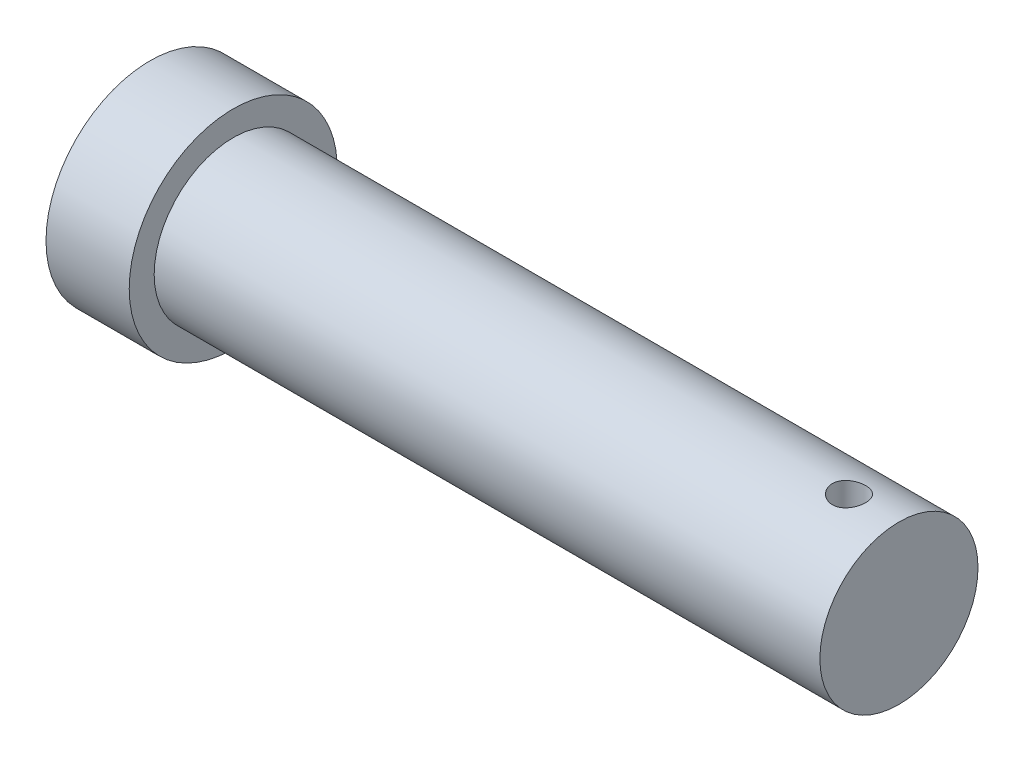
ISO-10303-21;
HEADER;
FILE_DESCRIPTION(('STEP AP214'),'2;1');
FILE_NAME('part.step','',(''),(''),'','','');
FILE_SCHEMA(('AUTOMOTIVE_DESIGN { 1 0 10303 214 1 1 1 1 }'));
ENDSEC;
DATA;
#1=APPLICATION_CONTEXT('core data for automotive mechanical design processes');
#2=APPLICATION_PROTOCOL_DEFINITION('international standard','automotive_design',2000,#1);
#3=PRODUCT_CONTEXT('',#1,'mechanical');
#4=PRODUCT('Part','Part','',(#3));
#5=PRODUCT_RELATED_PRODUCT_CATEGORY('part','',(#4));
#6=PRODUCT_DEFINITION_FORMATION('','',#4);
#7=PRODUCT_DEFINITION_CONTEXT('part definition',#1,'design');
#8=PRODUCT_DEFINITION('design','',#6,#7);
#9=PRODUCT_DEFINITION_SHAPE('','',#8);
#10=(LENGTH_UNIT() NAMED_UNIT(*) SI_UNIT(.MILLI.,.METRE.));
#11=(NAMED_UNIT(*) PLANE_ANGLE_UNIT() SI_UNIT($,.RADIAN.));
#12=(NAMED_UNIT(*) SI_UNIT($,.STERADIAN.) SOLID_ANGLE_UNIT());
#13=UNCERTAINTY_MEASURE_WITH_UNIT(LENGTH_MEASURE(1.E-05),#10,'distance_accuracy_value','');
#14=(GEOMETRIC_REPRESENTATION_CONTEXT(3) GLOBAL_UNCERTAINTY_ASSIGNED_CONTEXT((#13)) GLOBAL_UNIT_ASSIGNED_CONTEXT((#10,
#11,#12)) REPRESENTATION_CONTEXT('',''));
#15=CARTESIAN_POINT('',(0.,0.,0.));
#16=DIRECTION('',(0.,0.,1.));
#17=DIRECTION('',(1.,0.,0.));
#18=AXIS2_PLACEMENT_3D('',#15,#16,#17);
#19=CARTESIAN_POINT('',(27.,0.,0.));
#20=DIRECTION('',(-1.,0.,0.));
#21=DIRECTION('',(0.,0.,1.));
#22=AXIS2_PLACEMENT_3D('',#19,#20,#21);
#23=CYLINDRICAL_SURFACE('',#22,2.85);
#24=CARTESIAN_POINT('',(25.2,2.78612634315101,-0.600000000000002));
#25=CARTESIAN_POINT('',(25.1667009135158,2.78612701399481,-0.599998814546899));
#26=CARTESIAN_POINT('',(25.1333872784626,2.7867298142187,-0.597218504712191));
#27=CARTESIAN_POINT('',(25.0677051616874,2.78907185232426,-0.586181590233304));
#28=CARTESIAN_POINT('',(25.0353374153246,2.79081195104259,-0.57792083729598));
#29=CARTESIAN_POINT('',(24.9725067509061,2.79522297529664,-0.556192827014321));
#30=CARTESIAN_POINT('',(24.9420418696356,2.79789292214083,-0.542731042280543));
#31=CARTESIAN_POINT('',(24.883802993568,2.80386163526096,-0.510998467066112));
#32=CARTESIAN_POINT('',(24.8560289011656,2.80716037871515,-0.492727851109587));
#33=CARTESIAN_POINT('',(24.8035242593864,2.81407270303313,-0.451591317533301));
#34=CARTESIAN_POINT('',(24.7788419748818,2.81769005736826,-0.428664420797291));
#35=CARTESIAN_POINT('',(24.7336436914392,2.82479890520401,-0.378997827627041));
#36=CARTESIAN_POINT('',(24.7131280017945,2.82829038934527,-0.352257848391798));
#37=CARTESIAN_POINT('',(24.6766559731375,2.83479502116815,-0.295402312917658));
#38=CARTESIAN_POINT('',(24.6607458085032,2.83780319845043,-0.265256518969008));
#39=CARTESIAN_POINT('',(24.634234844121,2.8429597572222,-0.202645438700851));
#40=CARTESIAN_POINT('',(24.6236334930786,2.84510822798339,-0.170180393624558));
#41=CARTESIAN_POINT('',(24.6081921978229,2.84827663660446,-0.104353810802695));
#42=CARTESIAN_POINT('',(24.6032706472889,2.84931254411822,-0.071012197447821));
#43=CARTESIAN_POINT('',(24.5990737512601,2.85019435909322,-0.00396153371564469));
#44=CARTESIAN_POINT('',(24.5997978054718,2.85004039307295,0.0297474772159071));
#45=CARTESIAN_POINT('',(24.606810286065,2.84857208969557,0.0960143037161188));
#46=CARTESIAN_POINT('',(24.613010777816,2.84727609060527,0.12858189051348));
#47=CARTESIAN_POINT('',(24.6306602894266,2.84369013675044,0.192203706548366));
#48=CARTESIAN_POINT('',(24.6421095347795,2.84140013928265,0.223257870703821));
#49=CARTESIAN_POINT('',(24.6700109762059,2.83605367252079,0.283218456751872));
#50=CARTESIAN_POINT('',(24.6864970043082,2.83299204532355,0.312108656865224));
#51=CARTESIAN_POINT('',(24.7239788944963,2.82643884013843,0.366744827495318));
#52=CARTESIAN_POINT('',(24.7449753284568,2.82294720765413,0.392490398654488));
#53=CARTESIAN_POINT('',(24.7913624179472,2.81583921697497,0.440628989093079));
#54=CARTESIAN_POINT('',(24.81683003759,2.81222175210661,0.462947742532497));
#55=CARTESIAN_POINT('',(24.8711836977434,2.80533327136152,0.503010620403578));
#56=CARTESIAN_POINT('',(24.9000698176529,2.80206226353503,0.52075463855097));
#57=CARTESIAN_POINT('',(24.9605545419967,2.7962344490956,0.55119401930204));
#58=CARTESIAN_POINT('',(24.9921599451801,2.79367950484636,0.563876252666613));
#59=CARTESIAN_POINT('',(25.0571195880866,2.78959953602516,0.583727840358225));
#60=CARTESIAN_POINT('',(25.0904735720488,2.78807436128166,0.590897998533679));
#61=CARTESIAN_POINT('',(25.1573074435771,2.78625700739595,0.599408596934946));
#62=CARTESIAN_POINT('',(25.1907730081155,2.78594204481568,0.600856774057887));
#63=CARTESIAN_POINT('',(25.2574674290928,2.78651945291243,0.598173192304226));
#64=CARTESIAN_POINT('',(25.2906963003754,2.78741174719711,0.594041786490441));
#65=CARTESIAN_POINT('',(25.3556048066558,2.79028169499288,0.580409527509041));
#66=CARTESIAN_POINT('',(25.3872973082081,2.7922475084337,0.570967216003285));
#67=CARTESIAN_POINT('',(25.4486504579894,2.79703245020334,0.547044208443247));
#68=CARTESIAN_POINT('',(25.4783109234017,2.79985165518622,0.532563059768795));
#69=CARTESIAN_POINT('',(25.535226614715,2.80607628905434,0.498733169468147));
#70=CARTESIAN_POINT('',(25.562441240349,2.80948954619567,0.479317590882256));
#71=CARTESIAN_POINT('',(25.613265558928,2.81649668188266,0.436258163280139));
#72=CARTESIAN_POINT('',(25.6368748381276,2.8200905810958,0.412613829651866));
#73=CARTESIAN_POINT('',(25.6802321079327,2.82712864439007,0.361282267099748));
#74=CARTESIAN_POINT('',(25.6999069165104,2.83056918247882,0.333532645153904));
#75=CARTESIAN_POINT('',(25.7343153298923,2.83684783547197,0.275059455569286));
#76=CARTESIAN_POINT('',(25.7490491557515,2.83968597732494,0.244336021055369));
#77=CARTESIAN_POINT('',(25.7730533068833,2.84442467789728,0.180971054854553));
#78=CARTESIAN_POINT('',(25.7823567097955,2.84633090128262,0.148342496448086));
#79=CARTESIAN_POINT('',(25.7953399391982,2.84901539172905,0.0819412481818664));
#80=CARTESIAN_POINT('',(25.7990205200098,2.8497938100884,0.0481687124121357));
#81=CARTESIAN_POINT('',(25.8006218107384,2.85013090115407,-0.0188651925927722));
#82=CARTESIAN_POINT('',(25.7986521195598,2.84971278357047,-0.0521238749636385));
#83=CARTESIAN_POINT('',(25.7892525128007,2.84775309308191,-0.117824895016765));
#84=CARTESIAN_POINT('',(25.7818226816768,2.84621153755414,-0.150267245317907));
#85=CARTESIAN_POINT('',(25.761764552677,2.84217942631055,-0.213337271614287));
#86=CARTESIAN_POINT('',(25.7491507408893,2.83969151651298,-0.243969734480415));
#87=CARTESIAN_POINT('',(25.7190972625363,2.83403334439395,-0.302698540824581));
#88=CARTESIAN_POINT('',(25.7016571655691,2.83086302122135,-0.330794657818092));
#89=CARTESIAN_POINT('',(25.6620832652322,2.82411669006248,-0.384191161912313));
#90=CARTESIAN_POINT('',(25.6398717799327,2.82053448985304,-0.409433199925055));
#91=CARTESIAN_POINT('',(25.5915436325484,2.81340299548733,-0.45586929743981));
#92=CARTESIAN_POINT('',(25.5654260386776,2.80985370939772,-0.477062388327741));
#93=CARTESIAN_POINT('',(25.5096447381852,2.8031419671117,-0.515046283249627));
#94=CARTESIAN_POINT('',(25.4799417055773,2.79998475050277,-0.53178030827098));
#95=CARTESIAN_POINT('',(25.4180859036835,2.7944796118598,-0.559992792367471));
#96=CARTESIAN_POINT('',(25.3859353037988,2.79213098310132,-0.571475843811149));
#97=CARTESIAN_POINT('',(25.3281111899501,2.78895879032804,-0.586730647304422));
#98=CARTESIAN_POINT('',(25.3027588684033,2.78790346017021,-0.591697402827667));
#99=CARTESIAN_POINT('',(25.2516072650666,2.78648699116868,-0.59833246942034));
#100=CARTESIAN_POINT('',(25.2258080020601,2.78612582322268,-0.600000918769235));
#101=CARTESIAN_POINT('',(25.2,2.78612634315101,-0.600000000000002));
#102=B_SPLINE_CURVE_WITH_KNOTS('',3,(#24,#25,#26,#27,#28,#29,#30,#31,#32,#33,#34,#35,#36,#37,
#38,#39,#40,#41,#42,#43,#44,#45,#46,#47,#48,#49,#50,#51,#52,#53,#54,#55,#56,#57,#58,#59,#60,#61,
#62,#63,#64,#65,#66,#67,#68,#69,#70,#71,#72,#73,#74,#75,#76,#77,#78,#79,#80,#81,#82,#83,#84,#85,
#86,#87,#88,#89,#90,#91,#92,#93,#94,#95,#96,#97,#98,#99,#100,#101),.UNSPECIFIED.,.T.,.F.,(4,2,2,
2,2,2,2,2,2,2,2,2,2,2,2,2,2,2,2,2,2,2,2,2,2,2,2,2,2,2,2,2,2,2,2,2,2,2,4),(0.,0.0998027160016778,
0.199681061654563,0.299454598647128,0.399224515115622,0.50039673159231,0.601576455512071,
0.703737997387747,0.805888928082372,0.906553147157054,1.00720666281771,1.10627279301604,
1.20534317962625,1.30509422326277,1.40485792181237,1.50654640831832,1.60823725712771,
1.71019018337471,1.81212823858849,1.91213752842906,2.01214049021469,2.11106214233086,
2.20999268250927,2.31034218697567,2.41070319879473,2.51278576524374,2.61486376400487,
2.71631331865759,2.81774926230401,2.91723102438429,3.01671124772717,3.11591535404781,
3.2151283101142,3.31609896959206,3.41709375373019,3.51931896465334,3.62145460019752,
3.6988085748546,3.77615930642484),.UNSPECIFIED.);
#103=CARTESIAN_POINT('',(25.2,2.78612634315101,-0.600000000000002));
#104=VERTEX_POINT('',#103);
#105=EDGE_CURVE('E50',#104,#104,#102,.T.);
#106=ORIENTED_EDGE('',*,*,#105,.F.);
#107=EDGE_LOOP('',(#106));
#108=FACE_BOUND('',#107,.T.);
#109=CARTESIAN_POINT('',(25.2,-2.78612634315101,-0.600000000000002));
#110=CARTESIAN_POINT('',(25.2332990864842,-2.78612701399481,-0.599998814546899));
#111=CARTESIAN_POINT('',(25.2666127215374,-2.7867298142187,-0.597218504712192));
#112=CARTESIAN_POINT('',(25.3322948383126,-2.78907185232426,-0.586181590233305));
#113=CARTESIAN_POINT('',(25.3646625846754,-2.79081195104259,-0.577920837295979));
#114=CARTESIAN_POINT('',(25.4274932490939,-2.79522297529664,-0.556192827014321));
#115=CARTESIAN_POINT('',(25.4579581303644,-2.79789292214083,-0.542731042280546));
#116=CARTESIAN_POINT('',(25.516197006432,-2.80386163526096,-0.510998467066115));
#117=CARTESIAN_POINT('',(25.5439710988344,-2.80716037871515,-0.492727851109587));
#118=CARTESIAN_POINT('',(25.5964757406136,-2.81407270303313,-0.451591317533301));
#119=CARTESIAN_POINT('',(25.6211580251182,-2.81769005736826,-0.428664420797292));
#120=CARTESIAN_POINT('',(25.6663563085608,-2.82479890520401,-0.378997827627043));
#121=CARTESIAN_POINT('',(25.6868719982054,-2.82829038934527,-0.352257848391798));
#122=CARTESIAN_POINT('',(25.7233440268625,-2.83479502116815,-0.295402312917658));
#123=CARTESIAN_POINT('',(25.7392541914968,-2.83780319845043,-0.265256518969008));
#124=CARTESIAN_POINT('',(25.765765155879,-2.8429597572222,-0.202645438700851));
#125=CARTESIAN_POINT('',(25.7763665069214,-2.84510822798339,-0.170180393624558));
#126=CARTESIAN_POINT('',(25.7918078021771,-2.84827663660446,-0.104353810802694));
#127=CARTESIAN_POINT('',(25.7967293527111,-2.84931254411822,-0.071012197447821));
#128=CARTESIAN_POINT('',(25.8009262487399,-2.85019435909322,-0.00396153371564484));
#129=CARTESIAN_POINT('',(25.8002021945282,-2.85004039307295,0.029747477215907));
#130=CARTESIAN_POINT('',(25.793189713935,-2.84857208969557,0.0960143037161187));
#131=CARTESIAN_POINT('',(25.786989222184,-2.84727609060527,0.12858189051348));
#132=CARTESIAN_POINT('',(25.7693397105734,-2.84369013675044,0.192203706548366));
#133=CARTESIAN_POINT('',(25.7578904652205,-2.84140013928265,0.223257870703821));
#134=CARTESIAN_POINT('',(25.7299890237941,-2.83605367252079,0.283218456751872));
#135=CARTESIAN_POINT('',(25.7135029956918,-2.83299204532355,0.312108656865224));
#136=CARTESIAN_POINT('',(25.6760211055037,-2.82643884013843,0.366744827495318));
#137=CARTESIAN_POINT('',(25.6550246715432,-2.82294720765413,0.392490398654488));
#138=CARTESIAN_POINT('',(25.6086375820528,-2.81583921697497,0.440628989093079));
#139=CARTESIAN_POINT('',(25.58316996241,-2.81222175210661,0.462947742532498));
#140=CARTESIAN_POINT('',(25.5288163022566,-2.80533327136152,0.503010620403579));
#141=CARTESIAN_POINT('',(25.4999301823471,-2.80206226353503,0.520754638550969));
#142=CARTESIAN_POINT('',(25.4394454580033,-2.7962344490956,0.55119401930204));
#143=CARTESIAN_POINT('',(25.4078400548199,-2.79367950484636,0.563876252666613));
#144=CARTESIAN_POINT('',(25.3428804119134,-2.78959953602516,0.583727840358225));
#145=CARTESIAN_POINT('',(25.3095264279512,-2.78807436128166,0.59089799853368));
#146=CARTESIAN_POINT('',(25.2426925564229,-2.78625700739595,0.599408596934946));
#147=CARTESIAN_POINT('',(25.2092269918845,-2.78594204481568,0.600856774057887));
#148=CARTESIAN_POINT('',(25.1425325709072,-2.78651945291243,0.598173192304226));
#149=CARTESIAN_POINT('',(25.1093036996246,-2.78741174719711,0.594041786490442));
#150=CARTESIAN_POINT('',(25.0443951933442,-2.79028169499288,0.580409527509041));
#151=CARTESIAN_POINT('',(25.0127026917919,-2.7922475084337,0.570967216003284));
#152=CARTESIAN_POINT('',(24.9513495420106,-2.79703245020334,0.547044208443245));
#153=CARTESIAN_POINT('',(24.9216890765983,-2.79985165518622,0.532563059768795));
#154=CARTESIAN_POINT('',(24.864773385285,-2.80607628905434,0.498733169468147));
#155=CARTESIAN_POINT('',(24.837558759651,-2.80948954619567,0.479317590882256));
#156=CARTESIAN_POINT('',(24.786734441072,-2.81649668188266,0.436258163280138));
#157=CARTESIAN_POINT('',(24.7631251618724,-2.8200905810958,0.412613829651866));
#158=CARTESIAN_POINT('',(24.7197678920673,-2.82712864439007,0.361282267099748));
#159=CARTESIAN_POINT('',(24.7000930834896,-2.83056918247882,0.333532645153904));
#160=CARTESIAN_POINT('',(24.6656846701077,-2.83684783547197,0.275059455569286));
#161=CARTESIAN_POINT('',(24.6509508442485,-2.83968597732494,0.24433602105537));
#162=CARTESIAN_POINT('',(24.6269466931167,-2.84442467789728,0.180971054854553));
#163=CARTESIAN_POINT('',(24.6176432902045,-2.84633090128262,0.148342496448086));
#164=CARTESIAN_POINT('',(24.6046600608018,-2.84901539172905,0.081941248181865));
#165=CARTESIAN_POINT('',(24.6009794799902,-2.8497938100884,0.0481687124121351));
#166=CARTESIAN_POINT('',(24.5993781892616,-2.85013090115407,-0.018865192592772));
#167=CARTESIAN_POINT('',(24.6013478804402,-2.84971278357047,-0.0521238749636384));
#168=CARTESIAN_POINT('',(24.6107474871993,-2.84775309308191,-0.117824895016766));
#169=CARTESIAN_POINT('',(24.6181773183232,-2.84621153755414,-0.150267245317908));
#170=CARTESIAN_POINT('',(24.638235447323,-2.84217942631055,-0.213337271614286));
#171=CARTESIAN_POINT('',(24.6508492591107,-2.83969151651298,-0.243969734480414));
#172=CARTESIAN_POINT('',(24.6809027374637,-2.83403334439395,-0.302698540824579));
#173=CARTESIAN_POINT('',(24.6983428344309,-2.83086302122135,-0.330794657818091));
#174=CARTESIAN_POINT('',(24.7379167347678,-2.82411669006248,-0.384191161912314));
#175=CARTESIAN_POINT('',(24.7601282200673,-2.82053448985304,-0.409433199925058));
#176=CARTESIAN_POINT('',(24.8084563674516,-2.81340299548733,-0.455869297439812));
#177=CARTESIAN_POINT('',(24.8345739613223,-2.80985370939772,-0.477062388327742));
#178=CARTESIAN_POINT('',(24.8903552618148,-2.8031419671117,-0.515046283249627));
#179=CARTESIAN_POINT('',(24.9200582944227,-2.79998475050277,-0.531780308270979));
#180=CARTESIAN_POINT('',(24.9819140963165,-2.7944796118598,-0.55999279236747));
#181=CARTESIAN_POINT('',(25.0140646962012,-2.79213098310132,-0.571475843811149));
#182=CARTESIAN_POINT('',(25.0718888100499,-2.78895879032804,-0.586730647304422));
#183=CARTESIAN_POINT('',(25.0972411315967,-2.78790346017021,-0.591697402827667));
#184=CARTESIAN_POINT('',(25.1483927349334,-2.78648699116868,-0.598332469420339));
#185=CARTESIAN_POINT('',(25.1741919979399,-2.78612582322268,-0.600000918769234));
#186=CARTESIAN_POINT('',(25.2,-2.78612634315101,-0.600000000000002));
#187=B_SPLINE_CURVE_WITH_KNOTS('',3,(#109,#110,#111,#112,#113,#114,#115,#116,#117,#118,#119,
#120,#121,#122,#123,#124,#125,#126,#127,#128,#129,#130,#131,#132,#133,#134,#135,#136,#137,#138,
#139,#140,#141,#142,#143,#144,#145,#146,#147,#148,#149,#150,#151,#152,#153,#154,#155,#156,#157,
#158,#159,#160,#161,#162,#163,#164,#165,#166,#167,#168,#169,#170,#171,#172,#173,#174,#175,#176,
#177,#178,#179,#180,#181,#182,#183,#184,#185,#186),.UNSPECIFIED.,.T.,.F.,(4,2,2,2,2,2,2,2,2,2,2,
2,2,2,2,2,2,2,2,2,2,2,2,2,2,2,2,2,2,2,2,2,2,2,2,2,2,2,4),(0.,0.0998027160016742,
0.199681061654556,0.299454598647123,0.399224515115619,0.500396731592306,0.60157645551207,
0.703737997387746,0.805888928082371,0.906553147157052,1.0072066628177,1.10627279301604,
1.20534317962625,1.30509422326277,1.40485792181237,1.50654640831832,1.60823725712771,
1.71019018337471,1.81212823858849,1.91213752842906,2.0121404902147,2.11106214233086,
2.20999268250927,2.31034218697567,2.41070319879473,2.51278576524374,2.61486376400487,
2.71631331865759,2.81774926230401,2.91723102438429,3.01671124772717,3.1159153540478,
3.2151283101142,3.31609896959207,3.41709375373019,3.51931896465334,3.62145460019752,
3.6988085748546,3.77615930642484),.UNSPECIFIED.);
#188=CARTESIAN_POINT('',(25.2,-2.78612634315101,-0.600000000000002));
#189=VERTEX_POINT('',#188);
#190=EDGE_CURVE('E56',#189,#189,#187,.T.);
#191=ORIENTED_EDGE('',*,*,#190,.F.);
#192=EDGE_LOOP('',(#191));
#193=FACE_BOUND('',#192,.T.);
#194=CARTESIAN_POINT('',(27.,0.,0.));
#195=DIRECTION('',(1.,0.,0.));
#196=DIRECTION('',(0.,0.,-1.));
#197=AXIS2_PLACEMENT_3D('',#194,#195,#196);
#198=CIRCLE('',#197,2.85);
#199=CARTESIAN_POINT('',(27.,0.,-2.85));
#200=VERTEX_POINT('',#199);
#201=EDGE_CURVE('E45',#200,#200,#198,.T.);
#202=ORIENTED_EDGE('',*,*,#201,.F.);
#203=EDGE_LOOP('',(#202));
#204=FACE_BOUND('',#203,.T.);
#205=CARTESIAN_POINT('',(3.,0.,0.));
#206=DIRECTION('',(-1.,0.,0.));
#207=DIRECTION('',(0.,0.,1.));
#208=AXIS2_PLACEMENT_3D('',#205,#206,#207);
#209=CIRCLE('',#208,2.85);
#210=CARTESIAN_POINT('',(3.,0.,2.85));
#211=VERTEX_POINT('',#210);
#212=EDGE_CURVE('E10',#211,#211,#209,.T.);
#213=ORIENTED_EDGE('',*,*,#212,.F.);
#214=EDGE_LOOP('',(#213));
#215=FACE_BOUND('',#214,.T.);
#216=ADVANCED_FACE('F37',(#108,#193,#204,#215),#23,.T.);
#217=CARTESIAN_POINT('',(27.,0.,0.));
#218=DIRECTION('',(1.,0.,0.));
#219=DIRECTION('',(0.,0.,-1.));
#220=AXIS2_PLACEMENT_3D('',#217,#218,#219);
#221=PLANE('',#220);
#222=ORIENTED_EDGE('',*,*,#201,.T.);
#223=EDGE_LOOP('',(#222));
#224=FACE_BOUND('',#223,.T.);
#225=ADVANCED_FACE('F77',(#224),#221,.T.);
#226=CARTESIAN_POINT('',(25.2,15.,0.));
#227=DIRECTION('',(0.,-1.,0.));
#228=DIRECTION('',(0.,0.,-1.));
#229=AXIS2_PLACEMENT_3D('',#226,#227,#228);
#230=CYLINDRICAL_SURFACE('',#229,0.600000000000002);
#231=ORIENTED_EDGE('',*,*,#190,.T.);
#232=EDGE_LOOP('',(#231));
#233=FACE_BOUND('',#232,.T.);
#234=ORIENTED_EDGE('',*,*,#105,.T.);
#235=EDGE_LOOP('',(#234));
#236=FACE_BOUND('',#235,.T.);
#237=ADVANCED_FACE('F71',(#233,#236),#230,.F.);
#238=CARTESIAN_POINT('',(3.,0.,0.));
#239=DIRECTION('',(-1.,0.,0.));
#240=DIRECTION('',(0.,0.,1.));
#241=AXIS2_PLACEMENT_3D('',#238,#239,#240);
#242=CYLINDRICAL_SURFACE('',#241,3.75);
#243=CARTESIAN_POINT('',(3.,0.,0.));
#244=DIRECTION('',(-1.,0.,0.));
#245=DIRECTION('',(0.,0.,1.));
#246=AXIS2_PLACEMENT_3D('',#243,#244,#245);
#247=CIRCLE('',#246,3.75);
#248=CARTESIAN_POINT('',(3.,0.,3.75));
#249=VERTEX_POINT('',#248);
#250=EDGE_CURVE('E67',#249,#249,#247,.T.);
#251=ORIENTED_EDGE('',*,*,#250,.T.);
#252=EDGE_LOOP('',(#251));
#253=FACE_BOUND('',#252,.T.);
#254=CARTESIAN_POINT('',(0.,0.,0.));
#255=DIRECTION('',(-1.,0.,0.));
#256=DIRECTION('',(0.,0.,1.));
#257=AXIS2_PLACEMENT_3D('',#254,#255,#256);
#258=CIRCLE('',#257,3.75);
#259=CARTESIAN_POINT('',(0.,0.,3.75));
#260=VERTEX_POINT('',#259);
#261=EDGE_CURVE('E59',#260,#260,#258,.T.);
#262=ORIENTED_EDGE('',*,*,#261,.F.);
#263=EDGE_LOOP('',(#262));
#264=FACE_BOUND('',#263,.T.);
#265=ADVANCED_FACE('F76',(#253,#264),#242,.T.);
#266=CARTESIAN_POINT('',(3.,0.,0.));
#267=DIRECTION('',(-1.,0.,0.));
#268=DIRECTION('',(0.,0.,1.));
#269=AXIS2_PLACEMENT_3D('',#266,#267,#268);
#270=PLANE('',#269);
#271=ORIENTED_EDGE('',*,*,#212,.T.);
#272=EDGE_LOOP('',(#271));
#273=FACE_BOUND('',#272,.T.);
#274=ORIENTED_EDGE('',*,*,#250,.F.);
#275=EDGE_LOOP('',(#274));
#276=FACE_BOUND('',#275,.T.);
#277=ADVANCED_FACE('F84',(#273,#276),#270,.F.);
#278=CARTESIAN_POINT('',(0.,0.,0.));
#279=DIRECTION('',(1.,0.,0.));
#280=DIRECTION('',(0.,0.,-1.));
#281=AXIS2_PLACEMENT_3D('',#278,#279,#280);
#282=PLANE('',#281);
#283=ORIENTED_EDGE('',*,*,#261,.T.);
#284=EDGE_LOOP('',(#283));
#285=FACE_BOUND('',#284,.T.);
#286=ADVANCED_FACE('F82',(#285),#282,.F.);
#287=CLOSED_SHELL('',(#216,#225,#237,#265,#277,#286));
#288=MANIFOLD_SOLID_BREP('B2',#287);
#289=ADVANCED_BREP_SHAPE_REPRESENTATION('',(#18,#288),#14);
#290=SHAPE_DEFINITION_REPRESENTATION(#9,#289);
ENDSEC;
END-ISO-10303-21;
